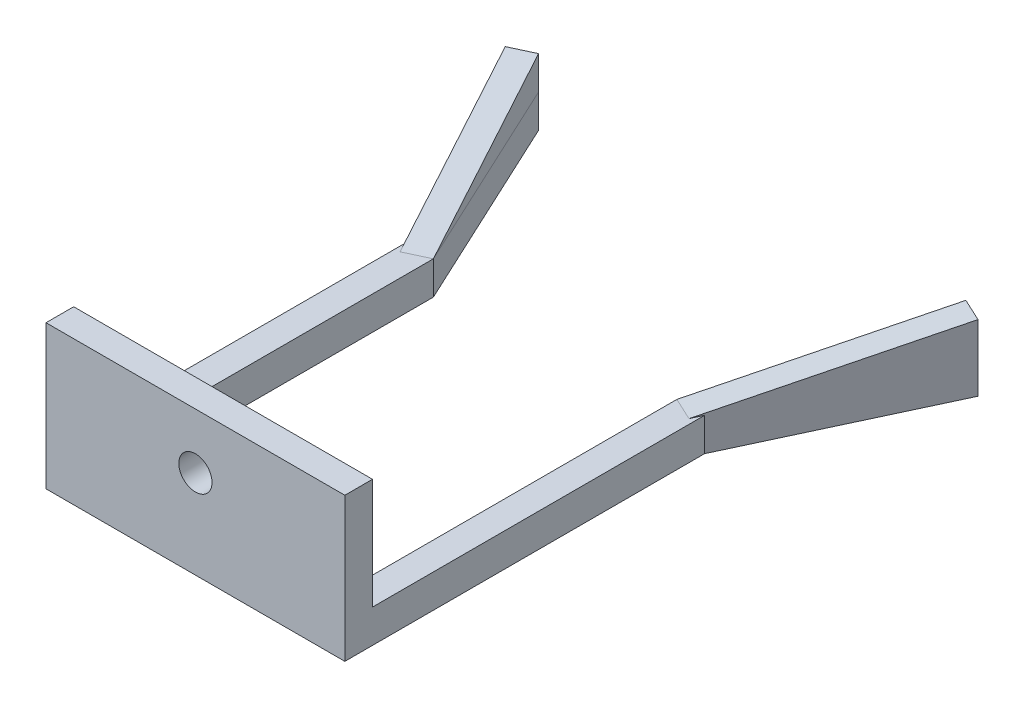
ISO-10303-21;
HEADER;
FILE_DESCRIPTION(('STEP AP214'),'2;1');
FILE_NAME('part.step','',(''),(''),'','','');
FILE_SCHEMA(('AUTOMOTIVE_DESIGN { 1 0 10303 214 1 1 1 1 }'));
ENDSEC;
DATA;
#1=APPLICATION_CONTEXT('core data for automotive mechanical design processes');
#2=APPLICATION_PROTOCOL_DEFINITION('international standard','automotive_design',2000,#1);
#3=PRODUCT_CONTEXT('',#1,'mechanical');
#4=PRODUCT('Part','Part','',(#3));
#5=PRODUCT_RELATED_PRODUCT_CATEGORY('part','',(#4));
#6=PRODUCT_DEFINITION_FORMATION('','',#4);
#7=PRODUCT_DEFINITION_CONTEXT('part definition',#1,'design');
#8=PRODUCT_DEFINITION('design','',#6,#7);
#9=PRODUCT_DEFINITION_SHAPE('','',#8);
#10=(LENGTH_UNIT() NAMED_UNIT(*) SI_UNIT(.MILLI.,.METRE.));
#11=(NAMED_UNIT(*) PLANE_ANGLE_UNIT() SI_UNIT($,.RADIAN.));
#12=(NAMED_UNIT(*) SI_UNIT($,.STERADIAN.) SOLID_ANGLE_UNIT());
#13=UNCERTAINTY_MEASURE_WITH_UNIT(LENGTH_MEASURE(1.E-05),#10,'distance_accuracy_value','');
#14=(GEOMETRIC_REPRESENTATION_CONTEXT(3) GLOBAL_UNCERTAINTY_ASSIGNED_CONTEXT((#13)) GLOBAL_UNIT_ASSIGNED_CONTEXT((#10,
#11,#12)) REPRESENTATION_CONTEXT('',''));
#15=CARTESIAN_POINT('',(0.,0.,0.));
#16=DIRECTION('',(0.,0.,1.));
#17=DIRECTION('',(1.,0.,0.));
#18=AXIS2_PLACEMENT_3D('',#15,#16,#17);
#19=CARTESIAN_POINT('',(-31.066947420242,3.,-20.6426287421474));
#20=DIRECTION('',(0.,-1.,0.));
#21=DIRECTION('',(0.,0.,-1.));
#22=AXIS2_PLACEMENT_3D('',#19,#20,#21);
#23=PLANE('',#22);
#24=DIRECTION('',(0.422618261740701,0.,0.906307787036649));
#25=VECTOR('',#24,1.);
#26=CARTESIAN_POINT('',(-13.0534845121082,3.,-29.0424444461013));
#27=LINE('',#26,#25);
#28=CARTESIAN_POINT('',(-21.3570649509297,3.,-46.8495301621617));
#29=VERTEX_POINT('',#28);
#30=CARTESIAN_POINT('',(-13.0534845121082,3.,-29.0424444461013));
#31=VERTEX_POINT('',#30);
#32=EDGE_CURVE('E62',#29,#31,#27,.T.);
#33=ORIENTED_EDGE('',*,*,#32,.F.);
#34=DIRECTION('',(0.906307787036649,0.,-0.422618261740701));
#35=VECTOR('',#34,1.);
#36=CARTESIAN_POINT('',(-39.3705278590635,3.,-38.4497144582079));
#37=LINE('',#36,#35);
#38=CARTESIAN_POINT('',(-19.3035804388215,3.,-47.8070857160605));
#39=VERTEX_POINT('',#38);
#40=EDGE_CURVE('E84',#29,#39,#37,.T.);
#41=ORIENTED_EDGE('',*,*,#40,.T.);
#42=DIRECTION('',(-0.422618261740701,0.,-0.906307787036649));
#43=VECTOR('',#42,1.);
#44=CARTESIAN_POINT('',(-11.,3.,-30.));
#45=LINE('',#44,#43);
#46=CARTESIAN_POINT('',(-11.,3.,-30.));
#47=VERTEX_POINT('',#46);
#48=EDGE_CURVE('E88',#47,#39,#45,.T.);
#49=ORIENTED_EDGE('',*,*,#48,.F.);
#50=DIRECTION('',(0.906307787036649,0.,-0.422618261740701));
#51=VECTOR('',#50,1.);
#52=CARTESIAN_POINT('',(-31.066947420242,3.,-20.6426287421474));
#53=LINE('',#52,#51);
#54=EDGE_CURVE('E106',#31,#47,#53,.T.);
#55=ORIENTED_EDGE('',*,*,#54,.F.);
#56=EDGE_LOOP('',(#33,#41,#49,#55));
#57=FACE_BOUND('',#56,.T.);
#58=ADVANCED_FACE('F55',(#57),#23,.T.);
#59=CARTESIAN_POINT('',(-31.066947420242,3.,-20.6426287421474));
#60=DIRECTION('',(0.0637893263798611,0.988543169454653,0.136796651876254));
#61=DIRECTION('',(0.,-0.137075822274623,0.990560557940672));
#62=AXIS2_PLACEMENT_3D('',#59,#60,#61);
#63=PLANE('',#62);
#64=DIRECTION('',(-0.417776395930569,0.150938405068258,-0.895924372298642));
#65=VECTOR('',#64,1.);
#66=CARTESIAN_POINT('',(-13.0534845121082,3.,-29.0424444461013));
#67=LINE('',#66,#65);
#68=CARTESIAN_POINT('',(-21.3570649509297,6.,-46.8495301621617));
#69=VERTEX_POINT('',#68);
#70=EDGE_CURVE('E108',#31,#69,#67,.T.);
#71=ORIENTED_EDGE('',*,*,#70,.F.);
#72=ORIENTED_EDGE('',*,*,#54,.T.);
#73=DIRECTION('',(0.417776395930568,-0.150938405068258,0.895924372298642));
#74=VECTOR('',#73,1.);
#75=CARTESIAN_POINT('',(-11.,3.,-30.));
#76=LINE('',#75,#74);
#77=CARTESIAN_POINT('',(-19.3035804388215,6.,-47.8070857160605));
#78=VERTEX_POINT('',#77);
#79=EDGE_CURVE('E92',#78,#47,#76,.T.);
#80=ORIENTED_EDGE('',*,*,#79,.F.);
#81=DIRECTION('',(0.906307787036649,0.,-0.422618261740701));
#82=VECTOR('',#81,1.);
#83=CARTESIAN_POINT('',(-39.3705278590635,6.,-38.4497144582079));
#84=LINE('',#83,#82);
#85=EDGE_CURVE('E91',#69,#78,#84,.T.);
#86=ORIENTED_EDGE('',*,*,#85,.F.);
#87=EDGE_LOOP('',(#71,#72,#80,#86));
#88=FACE_BOUND('',#87,.T.);
#89=ADVANCED_FACE('F111',(#88),#63,.T.);
#90=CARTESIAN_POINT('',(-39.3705278590635,6.,-38.4497144582079));
#91=DIRECTION('',(-0.422618261740701,0.,-0.906307787036649));
#92=DIRECTION('',(-0.906307787036649,0.,0.422618261740701));
#93=AXIS2_PLACEMENT_3D('',#90,#91,#92);
#94=PLANE('',#93);
#95=DIRECTION('',(0.,-1.,0.));
#96=VECTOR('',#95,1.);
#97=CARTESIAN_POINT('',(-21.3570649509297,6.,-46.8495301621617));
#98=LINE('',#97,#96);
#99=EDGE_CURVE('E12',#69,#29,#98,.T.);
#100=ORIENTED_EDGE('',*,*,#99,.F.);
#101=ORIENTED_EDGE('',*,*,#85,.T.);
#102=DIRECTION('',(0.,1.,0.));
#103=VECTOR('',#102,1.);
#104=CARTESIAN_POINT('',(-19.3035804388215,6.,-47.8070857160605));
#105=LINE('',#104,#103);
#106=EDGE_CURVE('E94',#39,#78,#105,.T.);
#107=ORIENTED_EDGE('',*,*,#106,.F.);
#108=ORIENTED_EDGE('',*,*,#40,.F.);
#109=EDGE_LOOP('',(#100,#101,#107,#108));
#110=FACE_BOUND('',#109,.T.);
#111=ADVANCED_FACE('F95',(#110),#94,.T.);
#112=CARTESIAN_POINT('',(2.45533479350875,0.,-1.14494141754756));
#113=DIRECTION('',(-0.906307787036649,0.,0.422618261740701));
#114=DIRECTION('',(0.422618261740701,0.,0.906307787036649));
#115=AXIS2_PLACEMENT_3D('',#112,#113,#114);
#116=PLANE('',#115);
#117=ORIENTED_EDGE('',*,*,#48,.T.);
#118=ORIENTED_EDGE('',*,*,#106,.T.);
#119=ORIENTED_EDGE('',*,*,#79,.T.);
#120=EDGE_LOOP('',(#117,#118,#119));
#121=FACE_BOUND('',#120,.T.);
#122=ADVANCED_FACE('F100',(#121),#116,.F.);
#123=CARTESIAN_POINT('',(-21.3570649509297,3.,-46.8495301621617));
#124=DIRECTION('',(0.906307787036649,0.,-0.422618261740701));
#125=DIRECTION('',(-0.422618261740701,0.,-0.906307787036649));
#126=AXIS2_PLACEMENT_3D('',#123,#124,#125);
#127=PLANE('',#126);
#128=ORIENTED_EDGE('',*,*,#32,.T.);
#129=ORIENTED_EDGE('',*,*,#70,.T.);
#130=ORIENTED_EDGE('',*,*,#99,.T.);
#131=EDGE_LOOP('',(#128,#129,#130));
#132=FACE_BOUND('',#131,.T.);
#133=ADVANCED_FACE('F110',(#132),#127,.F.);
#134=CLOSED_SHELL('',(#58,#89,#111,#122,#133));
#135=MANIFOLD_SOLID_BREP('B2',#134);
#136=CARTESIAN_POINT('',(0.,3.,0.));
#137=DIRECTION('',(0.,-1.,0.));
#138=DIRECTION('',(0.,0.,-1.));
#139=AXIS2_PLACEMENT_3D('',#136,#137,#138);
#140=PLANE('',#139);
#141=DIRECTION('',(-1.,0.,0.));
#142=VECTOR('',#141,1.);
#143=CARTESIAN_POINT('',(-13.5,3.,0.));
#144=LINE('',#143,#142);
#145=CARTESIAN_POINT('',(13.5,3.,0.));
#146=VERTEX_POINT('',#145);
#147=CARTESIAN_POINT('',(11.,3.,0.));
#148=VERTEX_POINT('',#147);
#149=EDGE_CURVE('E169',#146,#148,#144,.T.);
#150=ORIENTED_EDGE('',*,*,#149,.F.);
#151=DIRECTION('',(0.,0.,-1.));
#152=VECTOR('',#151,1.);
#153=CARTESIAN_POINT('',(13.5,3.,2.5));
#154=LINE('',#153,#152);
#155=CARTESIAN_POINT('',(13.5,3.,-29.9999999999999));
#156=VERTEX_POINT('',#155);
#157=EDGE_CURVE('E375',#146,#156,#154,.T.);
#158=ORIENTED_EDGE('',*,*,#157,.T.);
#159=DIRECTION('',(-0.422618261740701,0.,0.906307787036649));
#160=VECTOR('',#159,1.);
#161=CARTESIAN_POINT('',(13.0534845121082,3.,-29.0424444461013));
#162=LINE('',#161,#160);
#163=CARTESIAN_POINT('',(13.0534845121082,3.,-29.0424444461013));
#164=VERTEX_POINT('',#163);
#165=EDGE_CURVE('E162',#156,#164,#162,.T.);
#166=ORIENTED_EDGE('',*,*,#165,.T.);
#167=DIRECTION('',(-0.906307787036649,0.,-0.422618261740701));
#168=VECTOR('',#167,1.);
#169=CARTESIAN_POINT('',(31.066947420242,3.,-20.6426287421474));
#170=LINE('',#169,#168);
#171=CARTESIAN_POINT('',(11.,3.,-30.));
#172=VERTEX_POINT('',#171);
#173=EDGE_CURVE('E358',#164,#172,#170,.T.);
#174=ORIENTED_EDGE('',*,*,#173,.T.);
#175=DIRECTION('',(0.,0.,1.));
#176=VECTOR('',#175,1.);
#177=CARTESIAN_POINT('',(11.,3.,0.));
#178=LINE('',#177,#176);
#179=EDGE_CURVE('E254',#172,#148,#178,.T.);
#180=ORIENTED_EDGE('',*,*,#179,.T.);
#181=EDGE_LOOP('',(#150,#158,#166,#174,#180));
#182=FACE_BOUND('',#181,.T.);
#183=ADVANCED_FACE('F153',(#182),#140,.F.);
#184=DIRECTION('',(-1.,0.,0.));
#185=VECTOR('',#184,1.);
#186=CARTESIAN_POINT('',(0.,3.,0.));
#187=LINE('',#186,#185);
#188=CARTESIAN_POINT('',(-11.,3.,0.));
#189=VERTEX_POINT('',#188);
#190=CARTESIAN_POINT('',(-13.5,3.,0.));
#191=VERTEX_POINT('',#190);
#192=EDGE_CURVE('E53',#189,#191,#187,.T.);
#193=ORIENTED_EDGE('',*,*,#192,.F.);
#194=DIRECTION('',(0.,0.,-1.));
#195=VECTOR('',#194,1.);
#196=CARTESIAN_POINT('',(-11.,3.,0.));
#197=LINE('',#196,#195);
#198=CARTESIAN_POINT('',(-11.,3.,-30.));
#199=VERTEX_POINT('',#198);
#200=EDGE_CURVE('E244',#189,#199,#197,.T.);
#201=ORIENTED_EDGE('',*,*,#200,.T.);
#202=DIRECTION('',(-0.422618261740701,0.,-0.906307787036649));
#203=VECTOR('',#202,1.);
#204=CARTESIAN_POINT('',(-11.,3.,-30.));
#205=LINE('',#204,#203);
#206=CARTESIAN_POINT('',(-19.3035804388215,3.,-47.8070857160604));
#207=VERTEX_POINT('',#206);
#208=EDGE_CURVE('E248',#199,#207,#205,.T.);
#209=ORIENTED_EDGE('',*,*,#208,.T.);
#210=DIRECTION('',(-0.906307787036649,0.,0.422618261740701));
#211=VECTOR('',#210,1.);
#212=CARTESIAN_POINT('',(-19.3035804388215,3.,-47.8070857160604));
#213=LINE('',#212,#211);
#214=CARTESIAN_POINT('',(-21.3570649509297,3.,-46.8495301621617));
#215=VERTEX_POINT('',#214);
#216=EDGE_CURVE('E178',#207,#215,#213,.T.);
#217=ORIENTED_EDGE('',*,*,#216,.T.);
#218=DIRECTION('',(0.422618261740701,0.,0.906307787036649));
#219=VECTOR('',#218,1.);
#220=CARTESIAN_POINT('',(-21.3570649509297,3.,-46.8495301621617));
#221=LINE('',#220,#219);
#222=CARTESIAN_POINT('',(-13.5,3.,-30.));
#223=VERTEX_POINT('',#222);
#224=EDGE_CURVE('E311',#215,#223,#221,.T.);
#225=ORIENTED_EDGE('',*,*,#224,.T.);
#226=DIRECTION('',(0.,0.,1.));
#227=VECTOR('',#226,1.);
#228=CARTESIAN_POINT('',(-13.5,3.,-30.));
#229=LINE('',#228,#227);
#230=EDGE_CURVE('E232',#223,#191,#229,.T.);
#231=ORIENTED_EDGE('',*,*,#230,.T.);
#232=EDGE_LOOP('',(#193,#201,#209,#217,#225,#231));
#233=FACE_BOUND('',#232,.T.);
#234=ADVANCED_FACE('F246',(#233),#140,.F.);
#235=CARTESIAN_POINT('',(-21.3570649509297,3.,-46.8495301621617));
#236=DIRECTION('',(0.906307787036649,0.,-0.422618261740701));
#237=DIRECTION('',(-0.422618261740701,0.,-0.906307787036649));
#238=AXIS2_PLACEMENT_3D('',#235,#236,#237);
#239=PLANE('',#238);
#240=DIRECTION('',(0.422618261740701,0.,0.906307787036649));
#241=VECTOR('',#240,1.);
#242=CARTESIAN_POINT('',(-21.3570649509297,0.,-46.8495301621617));
#243=LINE('',#242,#241);
#244=CARTESIAN_POINT('',(-21.3570649509297,0.,-46.8495301621617));
#245=VERTEX_POINT('',#244);
#246=CARTESIAN_POINT('',(-13.5,0.,-30.));
#247=VERTEX_POINT('',#246);
#248=EDGE_CURVE('E275',#245,#247,#243,.T.);
#249=ORIENTED_EDGE('',*,*,#248,.T.);
#250=DIRECTION('',(0.,-1.,0.));
#251=VECTOR('',#250,1.);
#252=CARTESIAN_POINT('',(-13.5,3.,-30.));
#253=LINE('',#252,#251);
#254=EDGE_CURVE('E345',#223,#247,#253,.T.);
#255=ORIENTED_EDGE('',*,*,#254,.F.);
#256=ORIENTED_EDGE('',*,*,#224,.F.);
#257=DIRECTION('',(0.,-1.,0.));
#258=VECTOR('',#257,1.);
#259=CARTESIAN_POINT('',(-21.3570649509297,3.,-46.8495301621617));
#260=LINE('',#259,#258);
#261=EDGE_CURVE('E271',#215,#245,#260,.T.);
#262=ORIENTED_EDGE('',*,*,#261,.T.);
#263=EDGE_LOOP('',(#249,#255,#256,#262));
#264=FACE_BOUND('',#263,.T.);
#265=ADVANCED_FACE('F155',(#264),#239,.F.);
#266=CARTESIAN_POINT('',(-13.5,3.,-30.));
#267=DIRECTION('',(1.,0.,0.));
#268=DIRECTION('',(0.,0.,-1.));
#269=AXIS2_PLACEMENT_3D('',#266,#267,#268);
#270=PLANE('',#269);
#271=DIRECTION('',(0.,0.,1.));
#272=VECTOR('',#271,1.);
#273=CARTESIAN_POINT('',(-13.5,0.,-30.));
#274=LINE('',#273,#272);
#275=CARTESIAN_POINT('',(-13.5,0.,2.5));
#276=VERTEX_POINT('',#275);
#277=EDGE_CURVE('E279',#247,#276,#274,.T.);
#278=ORIENTED_EDGE('',*,*,#277,.T.);
#279=DIRECTION('',(0.,-1.,0.));
#280=VECTOR('',#279,1.);
#281=CARTESIAN_POINT('',(-13.5,3.,2.5));
#282=LINE('',#281,#280);
#283=CARTESIAN_POINT('',(-13.5,13.,2.5));
#284=VERTEX_POINT('',#283);
#285=EDGE_CURVE('E342',#284,#276,#282,.T.);
#286=ORIENTED_EDGE('',*,*,#285,.F.);
#287=DIRECTION('',(0.,0.,1.));
#288=VECTOR('',#287,1.);
#289=CARTESIAN_POINT('',(-13.5,13.,2.5));
#290=LINE('',#289,#288);
#291=CARTESIAN_POINT('',(-13.5,13.,0.));
#292=VERTEX_POINT('',#291);
#293=EDGE_CURVE('E392',#292,#284,#290,.T.);
#294=ORIENTED_EDGE('',*,*,#293,.F.);
#295=DIRECTION('',(0.,-1.,0.));
#296=VECTOR('',#295,1.);
#297=CARTESIAN_POINT('',(-13.5,13.,0.));
#298=LINE('',#297,#296);
#299=EDGE_CURVE('E406',#292,#191,#298,.T.);
#300=ORIENTED_EDGE('',*,*,#299,.T.);
#301=ORIENTED_EDGE('',*,*,#230,.F.);
#302=ORIENTED_EDGE('',*,*,#254,.T.);
#303=EDGE_LOOP('',(#278,#286,#294,#300,#301,#302));
#304=FACE_BOUND('',#303,.T.);
#305=ADVANCED_FACE('F525',(#304),#270,.F.);
#306=CARTESIAN_POINT('',(-13.5,3.,2.5));
#307=DIRECTION('',(0.,0.,-1.));
#308=DIRECTION('',(-1.,0.,0.));
#309=AXIS2_PLACEMENT_3D('',#306,#307,#308);
#310=PLANE('',#309);
#311=CARTESIAN_POINT('',(0.,8.,2.5));
#312=DIRECTION('',(0.,0.,-1.));
#313=DIRECTION('',(-1.,0.,0.));
#314=AXIS2_PLACEMENT_3D('',#311,#312,#313);
#315=CIRCLE('',#314,1.5);
#316=CARTESIAN_POINT('',(-1.5,8.,2.5));
#317=VERTEX_POINT('',#316);
#318=EDGE_CURVE('E393',#317,#317,#315,.T.);
#319=ORIENTED_EDGE('',*,*,#318,.T.);
#320=EDGE_LOOP('',(#319));
#321=FACE_BOUND('',#320,.T.);
#322=DIRECTION('',(1.,0.,0.));
#323=VECTOR('',#322,1.);
#324=CARTESIAN_POINT('',(-13.5,0.,2.5));
#325=LINE('',#324,#323);
#326=CARTESIAN_POINT('',(13.5,0.,2.5));
#327=VERTEX_POINT('',#326);
#328=EDGE_CURVE('E283',#276,#327,#325,.T.);
#329=ORIENTED_EDGE('',*,*,#328,.T.);
#330=DIRECTION('',(0.,-1.,0.));
#331=VECTOR('',#330,1.);
#332=CARTESIAN_POINT('',(13.5,3.,2.5));
#333=LINE('',#332,#331);
#334=CARTESIAN_POINT('',(13.5,13.,2.5));
#335=VERTEX_POINT('',#334);
#336=EDGE_CURVE('E338',#335,#327,#333,.T.);
#337=ORIENTED_EDGE('',*,*,#336,.F.);
#338=DIRECTION('',(1.,0.,0.));
#339=VECTOR('',#338,1.);
#340=CARTESIAN_POINT('',(-13.5,13.,2.5));
#341=LINE('',#340,#339);
#342=EDGE_CURVE('E398',#284,#335,#341,.T.);
#343=ORIENTED_EDGE('',*,*,#342,.F.);
#344=ORIENTED_EDGE('',*,*,#285,.T.);
#345=EDGE_LOOP('',(#329,#337,#343,#344));
#346=FACE_BOUND('',#345,.T.);
#347=ADVANCED_FACE('F531',(#321,#346),#310,.F.);
#348=CARTESIAN_POINT('',(13.5,3.,2.5));
#349=DIRECTION('',(-1.,0.,0.));
#350=DIRECTION('',(0.,0.,1.));
#351=AXIS2_PLACEMENT_3D('',#348,#349,#350);
#352=PLANE('',#351);
#353=DIRECTION('',(0.,0.,-1.));
#354=VECTOR('',#353,1.);
#355=CARTESIAN_POINT('',(13.5,0.,2.5));
#356=LINE('',#355,#354);
#357=CARTESIAN_POINT('',(13.5,0.,-30.));
#358=VERTEX_POINT('',#357);
#359=EDGE_CURVE('E286',#327,#358,#356,.T.);
#360=ORIENTED_EDGE('',*,*,#359,.T.);
#361=DIRECTION('',(0.,-1.,0.));
#362=VECTOR('',#361,1.);
#363=CARTESIAN_POINT('',(13.5,3.,-30.));
#364=LINE('',#363,#362);
#365=EDGE_CURVE('E334',#156,#358,#364,.T.);
#366=ORIENTED_EDGE('',*,*,#365,.F.);
#367=ORIENTED_EDGE('',*,*,#157,.F.);
#368=DIRECTION('',(0.,-1.,0.));
#369=VECTOR('',#368,1.);
#370=CARTESIAN_POINT('',(13.5,13.,0.));
#371=LINE('',#370,#369);
#372=CARTESIAN_POINT('',(13.5,13.,0.));
#373=VERTEX_POINT('',#372);
#374=EDGE_CURVE('E356',#373,#146,#371,.T.);
#375=ORIENTED_EDGE('',*,*,#374,.F.);
#376=DIRECTION('',(0.,0.,-1.));
#377=VECTOR('',#376,1.);
#378=CARTESIAN_POINT('',(13.5,13.,2.5));
#379=LINE('',#378,#377);
#380=EDGE_CURVE('E414',#335,#373,#379,.T.);
#381=ORIENTED_EDGE('',*,*,#380,.F.);
#382=ORIENTED_EDGE('',*,*,#336,.T.);
#383=EDGE_LOOP('',(#360,#366,#367,#375,#381,#382));
#384=FACE_BOUND('',#383,.T.);
#385=ADVANCED_FACE('F485',(#384),#352,.F.);
#386=CARTESIAN_POINT('',(21.3570649509297,3.,-46.8495301621617));
#387=DIRECTION('',(-0.906307787036649,0.,-0.422618261740701));
#388=DIRECTION('',(-0.422618261740701,0.,0.906307787036649));
#389=AXIS2_PLACEMENT_3D('',#386,#387,#388);
#390=PLANE('',#389);
#391=DIRECTION('',(0.422618261740701,0.,-0.906307787036649));
#392=VECTOR('',#391,1.);
#393=CARTESIAN_POINT('',(21.3570649509297,0.,-46.8495301621617));
#394=LINE('',#393,#392);
#395=CARTESIAN_POINT('',(21.3570649509297,0.,-46.8495301621617));
#396=VERTEX_POINT('',#395);
#397=EDGE_CURVE('E289',#358,#396,#394,.T.);
#398=ORIENTED_EDGE('',*,*,#397,.T.);
#399=DIRECTION('',(0.,-1.,0.));
#400=VECTOR('',#399,1.);
#401=CARTESIAN_POINT('',(21.3570649509297,3.,-46.8495301621617));
#402=LINE('',#401,#400);
#403=CARTESIAN_POINT('',(21.3570649509297,6.,-46.8495301621617));
#404=VERTEX_POINT('',#403);
#405=EDGE_CURVE('E330',#404,#396,#402,.T.);
#406=ORIENTED_EDGE('',*,*,#405,.F.);
#407=DIRECTION('',(0.417776395930569,0.150938405068258,-0.895924372298642));
#408=VECTOR('',#407,1.);
#409=CARTESIAN_POINT('',(13.0534845121082,3.,-29.0424444461013));
#410=LINE('',#409,#408);
#411=EDGE_CURVE('E361',#164,#404,#410,.T.);
#412=ORIENTED_EDGE('',*,*,#411,.F.);
#413=ORIENTED_EDGE('',*,*,#165,.F.);
#414=ORIENTED_EDGE('',*,*,#365,.T.);
#415=EDGE_LOOP('',(#398,#406,#412,#413,#414));
#416=FACE_BOUND('',#415,.T.);
#417=ADVANCED_FACE('F481',(#416),#390,.F.);
#418=CARTESIAN_POINT('',(19.3035804388215,3.,-47.8070857160604));
#419=DIRECTION('',(-0.422618261740701,0.,0.906307787036649));
#420=DIRECTION('',(0.906307787036649,0.,0.422618261740701));
#421=AXIS2_PLACEMENT_3D('',#418,#419,#420);
#422=PLANE('',#421);
#423=DIRECTION('',(-0.906307787036649,0.,-0.422618261740701));
#424=VECTOR('',#423,1.);
#425=CARTESIAN_POINT('',(19.3035804388215,0.,-47.8070857160604));
#426=LINE('',#425,#424);
#427=CARTESIAN_POINT('',(19.3035804388215,0.,-47.8070857160604));
#428=VERTEX_POINT('',#427);
#429=EDGE_CURVE('E292',#396,#428,#426,.T.);
#430=ORIENTED_EDGE('',*,*,#429,.T.);
#431=DIRECTION('',(0.,-1.,0.));
#432=VECTOR('',#431,1.);
#433=CARTESIAN_POINT('',(19.3035804388215,3.,-47.8070857160604));
#434=LINE('',#433,#432);
#435=CARTESIAN_POINT('',(19.3035804388215,6.,-47.8070857160605));
#436=VERTEX_POINT('',#435);
#437=EDGE_CURVE('E326',#436,#428,#434,.T.);
#438=ORIENTED_EDGE('',*,*,#437,.F.);
#439=DIRECTION('',(-0.906307787036649,0.,-0.422618261740701));
#440=VECTOR('',#439,1.);
#441=CARTESIAN_POINT('',(39.3705278590635,6.,-38.4497144582079));
#442=LINE('',#441,#440);
#443=EDGE_CURVE('E280',#404,#436,#442,.T.);
#444=ORIENTED_EDGE('',*,*,#443,.F.);
#445=ORIENTED_EDGE('',*,*,#405,.T.);
#446=EDGE_LOOP('',(#430,#438,#444,#445));
#447=FACE_BOUND('',#446,.T.);
#448=ADVANCED_FACE('F484',(#447),#422,.F.);
#449=CARTESIAN_POINT('',(11.,3.,-30.));
#450=DIRECTION('',(0.906307787036649,0.,0.422618261740701));
#451=DIRECTION('',(0.422618261740701,0.,-0.906307787036649));
#452=AXIS2_PLACEMENT_3D('',#449,#450,#451);
#453=PLANE('',#452);
#454=DIRECTION('',(-0.422618261740701,0.,0.906307787036649));
#455=VECTOR('',#454,1.);
#456=CARTESIAN_POINT('',(11.,0.,-30.));
#457=LINE('',#456,#455);
#458=CARTESIAN_POINT('',(11.,0.,-30.));
#459=VERTEX_POINT('',#458);
#460=EDGE_CURVE('E295',#428,#459,#457,.T.);
#461=ORIENTED_EDGE('',*,*,#460,.T.);
#462=DIRECTION('',(0.,-1.,0.));
#463=VECTOR('',#462,1.);
#464=CARTESIAN_POINT('',(11.,3.,-30.));
#465=LINE('',#464,#463);
#466=EDGE_CURVE('E322',#172,#459,#465,.T.);
#467=ORIENTED_EDGE('',*,*,#466,.F.);
#468=DIRECTION('',(-0.417776395930568,-0.150938405068258,0.895924372298642));
#469=VECTOR('',#468,1.);
#470=CARTESIAN_POINT('',(11.,3.,-30.));
#471=LINE('',#470,#469);
#472=EDGE_CURVE('E365',#436,#172,#471,.T.);
#473=ORIENTED_EDGE('',*,*,#472,.F.);
#474=ORIENTED_EDGE('',*,*,#437,.T.);
#475=EDGE_LOOP('',(#461,#467,#473,#474));
#476=FACE_BOUND('',#475,.T.);
#477=ADVANCED_FACE('F440',(#476),#453,.F.);
#478=CARTESIAN_POINT('',(11.,3.,0.));
#479=DIRECTION('',(1.,0.,0.));
#480=DIRECTION('',(0.,0.,-1.));
#481=AXIS2_PLACEMENT_3D('',#478,#479,#480);
#482=PLANE('',#481);
#483=DIRECTION('',(0.,0.,1.));
#484=VECTOR('',#483,1.);
#485=CARTESIAN_POINT('',(11.,0.,0.));
#486=LINE('',#485,#484);
#487=CARTESIAN_POINT('',(11.,0.,0.));
#488=VERTEX_POINT('',#487);
#489=EDGE_CURVE('E298',#459,#488,#486,.T.);
#490=ORIENTED_EDGE('',*,*,#489,.T.);
#491=DIRECTION('',(0.,-1.,0.));
#492=VECTOR('',#491,1.);
#493=CARTESIAN_POINT('',(11.,3.,0.));
#494=LINE('',#493,#492);
#495=EDGE_CURVE('E318',#148,#488,#494,.T.);
#496=ORIENTED_EDGE('',*,*,#495,.F.);
#497=ORIENTED_EDGE('',*,*,#179,.F.);
#498=ORIENTED_EDGE('',*,*,#466,.T.);
#499=EDGE_LOOP('',(#490,#496,#497,#498));
#500=FACE_BOUND('',#499,.T.);
#501=ADVANCED_FACE('F383',(#500),#482,.F.);
#502=CARTESIAN_POINT('',(-11.,3.,0.));
#503=DIRECTION('',(0.,0.,1.));
#504=DIRECTION('',(1.,0.,0.));
#505=AXIS2_PLACEMENT_3D('',#502,#503,#504);
#506=PLANE('',#505);
#507=CARTESIAN_POINT('',(0.,8.,0.));
#508=DIRECTION('',(0.,0.,-1.));
#509=DIRECTION('',(-1.,0.,0.));
#510=AXIS2_PLACEMENT_3D('',#507,#508,#509);
#511=CIRCLE('',#510,1.5);
#512=CARTESIAN_POINT('',(-1.5,8.,0.));
#513=VERTEX_POINT('',#512);
#514=EDGE_CURVE('E401',#513,#513,#511,.T.);
#515=ORIENTED_EDGE('',*,*,#514,.F.);
#516=EDGE_LOOP('',(#515));
#517=FACE_BOUND('',#516,.T.);
#518=DIRECTION('',(-1.,0.,0.));
#519=VECTOR('',#518,1.);
#520=CARTESIAN_POINT('',(-11.,0.,0.));
#521=LINE('',#520,#519);
#522=CARTESIAN_POINT('',(-11.,0.,0.));
#523=VERTEX_POINT('',#522);
#524=EDGE_CURVE('E301',#488,#523,#521,.T.);
#525=ORIENTED_EDGE('',*,*,#524,.T.);
#526=DIRECTION('',(0.,-1.,0.));
#527=VECTOR('',#526,1.);
#528=CARTESIAN_POINT('',(-11.,3.,0.));
#529=LINE('',#528,#527);
#530=EDGE_CURVE('E264',#189,#523,#529,.T.);
#531=ORIENTED_EDGE('',*,*,#530,.F.);
#532=ORIENTED_EDGE('',*,*,#192,.T.);
#533=ORIENTED_EDGE('',*,*,#299,.F.);
#534=DIRECTION('',(-1.,0.,0.));
#535=VECTOR('',#534,1.);
#536=CARTESIAN_POINT('',(-13.5,13.,0.));
#537=LINE('',#536,#535);
#538=EDGE_CURVE('E404',#373,#292,#537,.T.);
#539=ORIENTED_EDGE('',*,*,#538,.F.);
#540=ORIENTED_EDGE('',*,*,#374,.T.);
#541=ORIENTED_EDGE('',*,*,#149,.T.);
#542=ORIENTED_EDGE('',*,*,#495,.T.);
#543=EDGE_LOOP('',(#525,#531,#532,#533,#539,#540,#541,#542));
#544=FACE_BOUND('',#543,.T.);
#545=ADVANCED_FACE('F388',(#517,#544),#506,.F.);
#546=CARTESIAN_POINT('',(-11.,3.,0.));
#547=DIRECTION('',(-1.,0.,0.));
#548=DIRECTION('',(0.,0.,1.));
#549=AXIS2_PLACEMENT_3D('',#546,#547,#548);
#550=PLANE('',#549);
#551=DIRECTION('',(0.,0.,-1.));
#552=VECTOR('',#551,1.);
#553=CARTESIAN_POINT('',(-11.,0.,0.));
#554=LINE('',#553,#552);
#555=CARTESIAN_POINT('',(-11.,0.,-30.));
#556=VERTEX_POINT('',#555);
#557=EDGE_CURVE('E260',#523,#556,#554,.T.);
#558=ORIENTED_EDGE('',*,*,#557,.T.);
#559=DIRECTION('',(0.,-1.,0.));
#560=VECTOR('',#559,1.);
#561=CARTESIAN_POINT('',(-11.,3.,-30.));
#562=LINE('',#561,#560);
#563=EDGE_CURVE('E257',#199,#556,#562,.T.);
#564=ORIENTED_EDGE('',*,*,#563,.F.);
#565=ORIENTED_EDGE('',*,*,#200,.F.);
#566=ORIENTED_EDGE('',*,*,#530,.T.);
#567=EDGE_LOOP('',(#558,#564,#565,#566));
#568=FACE_BOUND('',#567,.T.);
#569=ADVANCED_FACE('F258',(#568),#550,.F.);
#570=CARTESIAN_POINT('',(-11.,3.,-30.));
#571=DIRECTION('',(-0.906307787036649,0.,0.422618261740701));
#572=DIRECTION('',(0.422618261740701,0.,0.906307787036649));
#573=AXIS2_PLACEMENT_3D('',#570,#571,#572);
#574=PLANE('',#573);
#575=DIRECTION('',(-0.422618261740701,0.,-0.906307787036649));
#576=VECTOR('',#575,1.);
#577=CARTESIAN_POINT('',(-11.,0.,-30.));
#578=LINE('',#577,#576);
#579=CARTESIAN_POINT('',(-19.3035804388215,0.,-47.8070857160604));
#580=VERTEX_POINT('',#579);
#581=EDGE_CURVE('E306',#556,#580,#578,.T.);
#582=ORIENTED_EDGE('',*,*,#581,.T.);
#583=DIRECTION('',(0.,-1.,0.));
#584=VECTOR('',#583,1.);
#585=CARTESIAN_POINT('',(-19.3035804388215,3.,-47.8070857160604));
#586=LINE('',#585,#584);
#587=EDGE_CURVE('E265',#207,#580,#586,.T.);
#588=ORIENTED_EDGE('',*,*,#587,.F.);
#589=ORIENTED_EDGE('',*,*,#208,.F.);
#590=ORIENTED_EDGE('',*,*,#563,.T.);
#591=EDGE_LOOP('',(#582,#588,#589,#590));
#592=FACE_BOUND('',#591,.T.);
#593=ADVANCED_FACE('F267',(#592),#574,.F.);
#594=CARTESIAN_POINT('',(-19.3035804388215,3.,-47.8070857160604));
#595=DIRECTION('',(0.422618261740701,0.,0.906307787036649));
#596=DIRECTION('',(0.906307787036649,0.,-0.422618261740701));
#597=AXIS2_PLACEMENT_3D('',#594,#595,#596);
#598=PLANE('',#597);
#599=DIRECTION('',(-0.906307787036649,0.,0.422618261740701));
#600=VECTOR('',#599,1.);
#601=CARTESIAN_POINT('',(-19.3035804388215,0.,-47.8070857160604));
#602=LINE('',#601,#600);
#603=EDGE_CURVE('E223',#580,#245,#602,.T.);
#604=ORIENTED_EDGE('',*,*,#603,.T.);
#605=ORIENTED_EDGE('',*,*,#261,.F.);
#606=ORIENTED_EDGE('',*,*,#216,.F.);
#607=ORIENTED_EDGE('',*,*,#587,.T.);
#608=EDGE_LOOP('',(#604,#605,#606,#607));
#609=FACE_BOUND('',#608,.T.);
#610=ADVANCED_FACE('F455',(#609),#598,.F.);
#611=CARTESIAN_POINT('',(0.,0.,0.));
#612=DIRECTION('',(0.,-1.,0.));
#613=DIRECTION('',(0.,0.,-1.));
#614=AXIS2_PLACEMENT_3D('',#611,#612,#613);
#615=PLANE('',#614);
#616=ORIENTED_EDGE('',*,*,#248,.F.);
#617=ORIENTED_EDGE('',*,*,#603,.F.);
#618=ORIENTED_EDGE('',*,*,#581,.F.);
#619=ORIENTED_EDGE('',*,*,#557,.F.);
#620=ORIENTED_EDGE('',*,*,#524,.F.);
#621=ORIENTED_EDGE('',*,*,#489,.F.);
#622=ORIENTED_EDGE('',*,*,#460,.F.);
#623=ORIENTED_EDGE('',*,*,#429,.F.);
#624=ORIENTED_EDGE('',*,*,#397,.F.);
#625=ORIENTED_EDGE('',*,*,#359,.F.);
#626=ORIENTED_EDGE('',*,*,#328,.F.);
#627=ORIENTED_EDGE('',*,*,#277,.F.);
#628=EDGE_LOOP('',(#616,#617,#618,#619,#620,#621,#622,#623,#624,#625,#626,#627));
#629=FACE_BOUND('',#628,.T.);
#630=ADVANCED_FACE('F452',(#629),#615,.T.);
#631=CARTESIAN_POINT('',(31.066947420242,3.,-20.6426287421474));
#632=DIRECTION('',(-0.0637893263798611,0.988543169454653,0.136796651876254));
#633=DIRECTION('',(0.,-0.137075822274623,0.990560557940672));
#634=AXIS2_PLACEMENT_3D('',#631,#632,#633);
#635=PLANE('',#634);
#636=ORIENTED_EDGE('',*,*,#411,.T.);
#637=ORIENTED_EDGE('',*,*,#443,.T.);
#638=ORIENTED_EDGE('',*,*,#472,.T.);
#639=ORIENTED_EDGE('',*,*,#173,.F.);
#640=EDGE_LOOP('',(#636,#637,#638,#639));
#641=FACE_BOUND('',#640,.T.);
#642=ADVANCED_FACE('F450',(#641),#635,.T.);
#643=CARTESIAN_POINT('',(0.,13.,0.));
#644=DIRECTION('',(0.,-1.,0.));
#645=DIRECTION('',(0.,0.,-1.));
#646=AXIS2_PLACEMENT_3D('',#643,#644,#645);
#647=PLANE('',#646);
#648=ORIENTED_EDGE('',*,*,#293,.T.);
#649=ORIENTED_EDGE('',*,*,#342,.T.);
#650=ORIENTED_EDGE('',*,*,#380,.T.);
#651=ORIENTED_EDGE('',*,*,#538,.T.);
#652=EDGE_LOOP('',(#648,#649,#650,#651));
#653=FACE_BOUND('',#652,.T.);
#654=ADVANCED_FACE('F508',(#653),#647,.F.);
#655=CARTESIAN_POINT('',(0.,8.,2.5));
#656=DIRECTION('',(0.,0.,-1.));
#657=DIRECTION('',(-1.,0.,0.));
#658=AXIS2_PLACEMENT_3D('',#655,#656,#657);
#659=CYLINDRICAL_SURFACE('',#658,1.5);
#660=ORIENTED_EDGE('',*,*,#318,.F.);
#661=EDGE_LOOP('',(#660));
#662=FACE_BOUND('',#661,.T.);
#663=ORIENTED_EDGE('',*,*,#514,.T.);
#664=EDGE_LOOP('',(#663));
#665=FACE_BOUND('',#664,.T.);
#666=ADVANCED_FACE('F429',(#662,#665),#659,.F.);
#667=CLOSED_SHELL('',(#183,#234,#265,#305,#347,#385,#417,#448,#477,#501,#545,#569,#593,#610,
#630,#642,#654,#666));
#668=MANIFOLD_SOLID_BREP('B6',#667);
#669=ADVANCED_BREP_SHAPE_REPRESENTATION('',(#18,#135,#668),#14);
#670=SHAPE_DEFINITION_REPRESENTATION(#9,#669);
ENDSEC;
END-ISO-10303-21;
